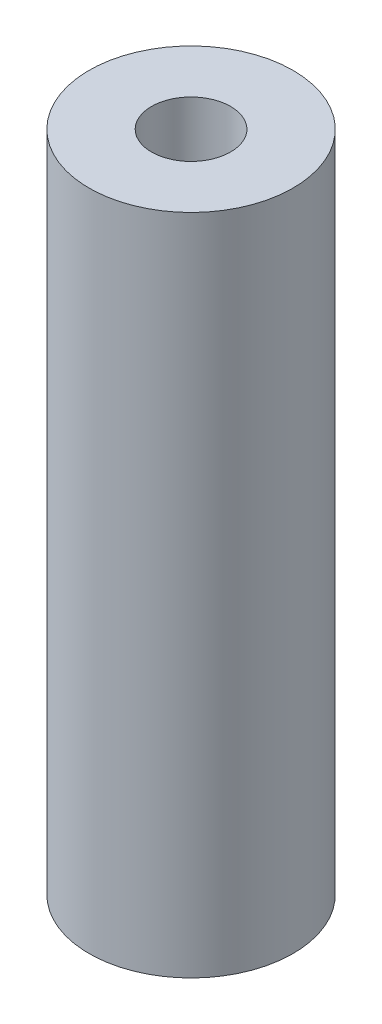
ISO-10303-21;
HEADER;
FILE_DESCRIPTION(('STEP AP214'),'2;1');
FILE_NAME('part.step','',(''),(''),'','','');
FILE_SCHEMA(('AUTOMOTIVE_DESIGN { 1 0 10303 214 1 1 1 1 }'));
ENDSEC;
DATA;
#1=APPLICATION_CONTEXT('core data for automotive mechanical design processes');
#2=APPLICATION_PROTOCOL_DEFINITION('international standard','automotive_design',2000,#1);
#3=PRODUCT_CONTEXT('',#1,'mechanical');
#4=PRODUCT('Part','Part','',(#3));
#5=PRODUCT_RELATED_PRODUCT_CATEGORY('part','',(#4));
#6=PRODUCT_DEFINITION_FORMATION('','',#4);
#7=PRODUCT_DEFINITION_CONTEXT('part definition',#1,'design');
#8=PRODUCT_DEFINITION('design','',#6,#7);
#9=PRODUCT_DEFINITION_SHAPE('','',#8);
#10=(LENGTH_UNIT() NAMED_UNIT(*) SI_UNIT(.MILLI.,.METRE.));
#11=(NAMED_UNIT(*) PLANE_ANGLE_UNIT() SI_UNIT($,.RADIAN.));
#12=(NAMED_UNIT(*) SI_UNIT($,.STERADIAN.) SOLID_ANGLE_UNIT());
#13=UNCERTAINTY_MEASURE_WITH_UNIT(LENGTH_MEASURE(1.E-05),#10,'distance_accuracy_value','');
#14=(GEOMETRIC_REPRESENTATION_CONTEXT(3) GLOBAL_UNCERTAINTY_ASSIGNED_CONTEXT((#13)) GLOBAL_UNIT_ASSIGNED_CONTEXT((#10,
#11,#12)) REPRESENTATION_CONTEXT('',''));
#15=CARTESIAN_POINT('',(0.,0.,0.));
#16=DIRECTION('',(0.,0.,1.));
#17=DIRECTION('',(1.,0.,0.));
#18=AXIS2_PLACEMENT_3D('',#15,#16,#17);
#19=CARTESIAN_POINT('',(0.,26.,0.));
#20=DIRECTION('',(0.,1.,0.));
#21=DIRECTION('',(0.,0.,1.));
#22=AXIS2_PLACEMENT_3D('',#19,#20,#21);
#23=PLANE('',#22);
#24=CARTESIAN_POINT('',(0.,26.,0.));
#25=DIRECTION('',(0.,1.,0.));
#26=DIRECTION('',(0.,0.,1.));
#27=AXIS2_PLACEMENT_3D('',#24,#25,#26);
#28=CIRCLE('',#27,4.);
#29=CARTESIAN_POINT('',(0.,26.,-4.));
#30=VERTEX_POINT('',#29);
#31=EDGE_CURVE('E10',#30,#30,#28,.T.);
#32=ORIENTED_EDGE('',*,*,#31,.T.);
#33=EDGE_LOOP('',(#32));
#34=FACE_BOUND('',#33,.T.);
#35=CARTESIAN_POINT('',(0.,26.,0.));
#36=DIRECTION('',(0.,1.,0.));
#37=DIRECTION('',(0.,0.,1.));
#38=AXIS2_PLACEMENT_3D('',#35,#36,#37);
#39=CIRCLE('',#38,1.55);
#40=CARTESIAN_POINT('',(0.,26.,-1.55));
#41=VERTEX_POINT('',#40);
#42=EDGE_CURVE('E42',#41,#41,#39,.T.);
#43=ORIENTED_EDGE('',*,*,#42,.F.);
#44=EDGE_LOOP('',(#43));
#45=FACE_BOUND('',#44,.T.);
#46=ADVANCED_FACE('F31',(#34,#45),#23,.T.);
#47=CARTESIAN_POINT('',(0.,0.,0.));
#48=DIRECTION('',(0.,1.,0.));
#49=DIRECTION('',(0.,0.,1.));
#50=AXIS2_PLACEMENT_3D('',#47,#48,#49);
#51=PLANE('',#50);
#52=CARTESIAN_POINT('',(0.,0.,0.));
#53=DIRECTION('',(0.,1.,0.));
#54=DIRECTION('',(0.,0.,1.));
#55=AXIS2_PLACEMENT_3D('',#52,#53,#54);
#56=CIRCLE('',#55,4.);
#57=CARTESIAN_POINT('',(0.,0.,-4.));
#58=VERTEX_POINT('',#57);
#59=EDGE_CURVE('E35',#58,#58,#56,.T.);
#60=ORIENTED_EDGE('',*,*,#59,.F.);
#61=EDGE_LOOP('',(#60));
#62=FACE_BOUND('',#61,.T.);
#63=CARTESIAN_POINT('',(0.,0.,0.));
#64=DIRECTION('',(0.,1.,0.));
#65=DIRECTION('',(0.,0.,1.));
#66=AXIS2_PLACEMENT_3D('',#63,#64,#65);
#67=CIRCLE('',#66,1.55);
#68=CARTESIAN_POINT('',(0.,0.,-1.55));
#69=VERTEX_POINT('',#68);
#70=EDGE_CURVE('E44',#69,#69,#67,.T.);
#71=ORIENTED_EDGE('',*,*,#70,.T.);
#72=EDGE_LOOP('',(#71));
#73=FACE_BOUND('',#72,.T.);
#74=ADVANCED_FACE('F54',(#62,#73),#51,.F.);
#75=CARTESIAN_POINT('',(0.,26.,0.));
#76=DIRECTION('',(0.,-1.,0.));
#77=DIRECTION('',(0.,0.,-1.));
#78=AXIS2_PLACEMENT_3D('',#75,#76,#77);
#79=CYLINDRICAL_SURFACE('',#78,4.);
#80=CARTESIAN_POINT('',(0.,26.,-4.));
#81=CARTESIAN_POINT('',(0.,25.7291666666667,-4.));
#82=CARTESIAN_POINT('',(0.,25.4583333333333,-4.));
#83=CARTESIAN_POINT('',(0.,24.9166666666667,-4.));
#84=CARTESIAN_POINT('',(0.,24.6458333333333,-4.));
#85=CARTESIAN_POINT('',(0.,24.1041666666667,-4.));
#86=CARTESIAN_POINT('',(0.,23.8333333333333,-4.));
#87=CARTESIAN_POINT('',(0.,23.2916666666667,-4.));
#88=CARTESIAN_POINT('',(0.,23.0208333333333,-4.));
#89=CARTESIAN_POINT('',(0.,22.4791666666667,-4.));
#90=CARTESIAN_POINT('',(0.,22.2083333333333,-4.));
#91=CARTESIAN_POINT('',(0.,21.6666666666667,-4.));
#92=CARTESIAN_POINT('',(0.,21.3958333333333,-4.));
#93=CARTESIAN_POINT('',(0.,20.8541666666667,-4.));
#94=CARTESIAN_POINT('',(0.,20.5833333333333,-4.));
#95=CARTESIAN_POINT('',(0.,20.0416666666667,-4.));
#96=CARTESIAN_POINT('',(0.,19.7708333333333,-4.));
#97=CARTESIAN_POINT('',(0.,19.2291666666667,-4.));
#98=CARTESIAN_POINT('',(0.,18.9583333333333,-4.));
#99=CARTESIAN_POINT('',(0.,18.4166666666667,-4.));
#100=CARTESIAN_POINT('',(0.,18.1458333333333,-4.));
#101=CARTESIAN_POINT('',(0.,17.6041666666667,-4.));
#102=CARTESIAN_POINT('',(0.,17.3333333333333,-4.));
#103=CARTESIAN_POINT('',(0.,16.7916666666667,-4.));
#104=CARTESIAN_POINT('',(0.,16.5208333333333,-4.));
#105=CARTESIAN_POINT('',(0.,15.9791666666667,-4.));
#106=CARTESIAN_POINT('',(0.,15.7083333333333,-4.));
#107=CARTESIAN_POINT('',(0.,15.1666666666667,-4.));
#108=CARTESIAN_POINT('',(0.,14.8958333333333,-4.));
#109=CARTESIAN_POINT('',(0.,14.3541666666667,-4.));
#110=CARTESIAN_POINT('',(0.,14.0833333333333,-4.));
#111=CARTESIAN_POINT('',(0.,13.5416666666667,-4.));
#112=CARTESIAN_POINT('',(0.,13.2708333333333,-4.));
#113=CARTESIAN_POINT('',(0.,12.7291666666667,-4.));
#114=CARTESIAN_POINT('',(0.,12.4583333333333,-4.));
#115=CARTESIAN_POINT('',(0.,11.9166666666667,-4.));
#116=CARTESIAN_POINT('',(0.,11.6458333333333,-4.));
#117=CARTESIAN_POINT('',(0.,11.1041666666667,-4.));
#118=CARTESIAN_POINT('',(0.,10.8333333333333,-4.));
#119=CARTESIAN_POINT('',(0.,10.2916666666667,-4.));
#120=CARTESIAN_POINT('',(0.,10.0208333333333,-4.));
#121=CARTESIAN_POINT('',(0.,9.47916666666667,-4.));
#122=CARTESIAN_POINT('',(0.,9.20833333333333,-4.));
#123=CARTESIAN_POINT('',(0.,8.66666666666667,-4.));
#124=CARTESIAN_POINT('',(0.,8.39583333333333,-4.));
#125=CARTESIAN_POINT('',(0.,7.85416666666667,-4.));
#126=CARTESIAN_POINT('',(0.,7.58333333333333,-4.));
#127=CARTESIAN_POINT('',(0.,7.04166666666667,-4.));
#128=CARTESIAN_POINT('',(0.,6.77083333333333,-4.));
#129=CARTESIAN_POINT('',(0.,6.22916666666667,-4.));
#130=CARTESIAN_POINT('',(0.,5.95833333333333,-4.));
#131=CARTESIAN_POINT('',(0.,5.41666666666667,-4.));
#132=CARTESIAN_POINT('',(0.,5.14583333333333,-4.));
#133=CARTESIAN_POINT('',(0.,4.60416666666667,-4.));
#134=CARTESIAN_POINT('',(0.,4.33333333333333,-4.));
#135=CARTESIAN_POINT('',(0.,3.79166666666667,-4.));
#136=CARTESIAN_POINT('',(0.,3.52083333333333,-4.));
#137=CARTESIAN_POINT('',(0.,2.97916666666667,-4.));
#138=CARTESIAN_POINT('',(0.,2.70833333333333,-4.));
#139=CARTESIAN_POINT('',(0.,2.16666666666667,-4.));
#140=CARTESIAN_POINT('',(0.,1.89583333333333,-4.));
#141=CARTESIAN_POINT('',(0.,1.35416666666667,-4.));
#142=CARTESIAN_POINT('',(0.,1.08333333333333,-4.));
#143=CARTESIAN_POINT('',(0.,0.541666666666667,-4.));
#144=CARTESIAN_POINT('',(0.,0.270833333333334,-4.));
#145=CARTESIAN_POINT('',(0.,0.,-4.));
#146=B_SPLINE_CURVE_WITH_KNOTS('',3,(#80,#81,#82,#83,#84,#85,#86,#87,#88,#89,#90,#91,#92,#93,
#94,#95,#96,#97,#98,#99,#100,#101,#102,#103,#104,#105,#106,#107,#108,#109,#110,#111,#112,#113,
#114,#115,#116,#117,#118,#119,#120,#121,#122,#123,#124,#125,#126,#127,#128,#129,#130,#131,#132,
#133,#134,#135,#136,#137,#138,#139,#140,#141,#142,#143,#144,#145),.UNSPECIFIED.,.F.,.F.,(4,2,2,
2,2,2,2,2,2,2,2,2,2,2,2,2,2,2,2,2,2,2,2,2,2,2,2,2,2,2,2,2,4),(0.,0.812500000000001,1.625,2.4375,
3.25,4.0625,4.875,5.6875,6.5,7.3125,8.125,8.9375,9.75,10.5625,11.375,12.1875,13.,13.8125,14.625,
15.4375,16.25,17.0625,17.875,18.6875,19.5,20.3125,21.125,21.9375,22.75,23.5625,24.375,25.1875,
26.),.UNSPECIFIED.);
#147=EDGE_CURVE('BSEAM33',#30,#58,#146,.T.);
#148=ORIENTED_EDGE('',*,*,#31,.F.);
#149=ORIENTED_EDGE('',*,*,#59,.T.);
#150=ORIENTED_EDGE('',*,*,#147,.T.);
#151=ORIENTED_EDGE('',*,*,#147,.F.);
#152=EDGE_LOOP('',(#148,#150,#149,#151));
#153=FACE_BOUND('',#152,.T.);
#154=ADVANCED_FACE('F33',(#153),#79,.T.);
#155=CARTESIAN_POINT('',(0.,26.,0.));
#156=DIRECTION('',(0.,-1.,0.));
#157=DIRECTION('',(0.,0.,-1.));
#158=AXIS2_PLACEMENT_3D('',#155,#156,#157);
#159=CYLINDRICAL_SURFACE('',#158,1.55);
#160=CARTESIAN_POINT('',(0.,26.,-1.55));
#161=CARTESIAN_POINT('',(0.,25.7291666666667,-1.55));
#162=CARTESIAN_POINT('',(0.,25.4583333333333,-1.55));
#163=CARTESIAN_POINT('',(0.,24.9166666666667,-1.55));
#164=CARTESIAN_POINT('',(0.,24.6458333333333,-1.55));
#165=CARTESIAN_POINT('',(0.,24.1041666666667,-1.55));
#166=CARTESIAN_POINT('',(0.,23.8333333333333,-1.55));
#167=CARTESIAN_POINT('',(0.,23.2916666666667,-1.55));
#168=CARTESIAN_POINT('',(0.,23.0208333333333,-1.55));
#169=CARTESIAN_POINT('',(0.,22.4791666666667,-1.55));
#170=CARTESIAN_POINT('',(0.,22.2083333333333,-1.55));
#171=CARTESIAN_POINT('',(0.,21.6666666666667,-1.55));
#172=CARTESIAN_POINT('',(0.,21.3958333333333,-1.55));
#173=CARTESIAN_POINT('',(0.,20.8541666666667,-1.55));
#174=CARTESIAN_POINT('',(0.,20.5833333333333,-1.55));
#175=CARTESIAN_POINT('',(0.,20.0416666666667,-1.55));
#176=CARTESIAN_POINT('',(0.,19.7708333333333,-1.55));
#177=CARTESIAN_POINT('',(0.,19.2291666666667,-1.55));
#178=CARTESIAN_POINT('',(0.,18.9583333333333,-1.55));
#179=CARTESIAN_POINT('',(0.,18.4166666666667,-1.55));
#180=CARTESIAN_POINT('',(0.,18.1458333333333,-1.55));
#181=CARTESIAN_POINT('',(0.,17.6041666666667,-1.55));
#182=CARTESIAN_POINT('',(0.,17.3333333333333,-1.55));
#183=CARTESIAN_POINT('',(0.,16.7916666666667,-1.55));
#184=CARTESIAN_POINT('',(0.,16.5208333333333,-1.55));
#185=CARTESIAN_POINT('',(0.,15.9791666666667,-1.55));
#186=CARTESIAN_POINT('',(0.,15.7083333333333,-1.55));
#187=CARTESIAN_POINT('',(0.,15.1666666666667,-1.55));
#188=CARTESIAN_POINT('',(0.,14.8958333333333,-1.55));
#189=CARTESIAN_POINT('',(0.,14.3541666666667,-1.55));
#190=CARTESIAN_POINT('',(0.,14.0833333333333,-1.55));
#191=CARTESIAN_POINT('',(0.,13.5416666666667,-1.55));
#192=CARTESIAN_POINT('',(0.,13.2708333333333,-1.55));
#193=CARTESIAN_POINT('',(0.,12.7291666666667,-1.55));
#194=CARTESIAN_POINT('',(0.,12.4583333333333,-1.55));
#195=CARTESIAN_POINT('',(0.,11.9166666666667,-1.55));
#196=CARTESIAN_POINT('',(0.,11.6458333333333,-1.55));
#197=CARTESIAN_POINT('',(0.,11.1041666666667,-1.55));
#198=CARTESIAN_POINT('',(0.,10.8333333333333,-1.55));
#199=CARTESIAN_POINT('',(0.,10.2916666666667,-1.55));
#200=CARTESIAN_POINT('',(0.,10.0208333333333,-1.55));
#201=CARTESIAN_POINT('',(0.,9.47916666666667,-1.55));
#202=CARTESIAN_POINT('',(0.,9.20833333333333,-1.55));
#203=CARTESIAN_POINT('',(0.,8.66666666666667,-1.55));
#204=CARTESIAN_POINT('',(0.,8.39583333333333,-1.55));
#205=CARTESIAN_POINT('',(0.,7.85416666666667,-1.55));
#206=CARTESIAN_POINT('',(0.,7.58333333333333,-1.55));
#207=CARTESIAN_POINT('',(0.,7.04166666666667,-1.55));
#208=CARTESIAN_POINT('',(0.,6.77083333333333,-1.55));
#209=CARTESIAN_POINT('',(0.,6.22916666666667,-1.55));
#210=CARTESIAN_POINT('',(0.,5.95833333333333,-1.55));
#211=CARTESIAN_POINT('',(0.,5.41666666666667,-1.55));
#212=CARTESIAN_POINT('',(0.,5.14583333333333,-1.55));
#213=CARTESIAN_POINT('',(0.,4.60416666666667,-1.55));
#214=CARTESIAN_POINT('',(0.,4.33333333333333,-1.55));
#215=CARTESIAN_POINT('',(0.,3.79166666666667,-1.55));
#216=CARTESIAN_POINT('',(0.,3.52083333333333,-1.55));
#217=CARTESIAN_POINT('',(0.,2.97916666666667,-1.55));
#218=CARTESIAN_POINT('',(0.,2.70833333333333,-1.55));
#219=CARTESIAN_POINT('',(0.,2.16666666666667,-1.55));
#220=CARTESIAN_POINT('',(0.,1.89583333333333,-1.55));
#221=CARTESIAN_POINT('',(0.,1.35416666666667,-1.55));
#222=CARTESIAN_POINT('',(0.,1.08333333333333,-1.55));
#223=CARTESIAN_POINT('',(0.,0.541666666666667,-1.55));
#224=CARTESIAN_POINT('',(0.,0.270833333333334,-1.55));
#225=CARTESIAN_POINT('',(0.,0.,-1.55));
#226=B_SPLINE_CURVE_WITH_KNOTS('',3,(#160,#161,#162,#163,#164,#165,#166,#167,#168,#169,#170,
#171,#172,#173,#174,#175,#176,#177,#178,#179,#180,#181,#182,#183,#184,#185,#186,#187,#188,#189,
#190,#191,#192,#193,#194,#195,#196,#197,#198,#199,#200,#201,#202,#203,#204,#205,#206,#207,#208,
#209,#210,#211,#212,#213,#214,#215,#216,#217,#218,#219,#220,#221,#222,#223,#224,#225),
.UNSPECIFIED.,.F.,.F.,(4,2,2,2,2,2,2,2,2,2,2,2,2,2,2,2,2,2,2,2,2,2,2,2,2,2,2,2,2,2,2,2,4),(0.,
0.812499999999997,1.625,2.4375,3.25,4.0625,4.875,5.6875,6.5,7.3125,8.125,8.93749999999999,
9.74999999999999,10.5625,11.375,12.1875,13.,13.8125,14.625,15.4375,16.25,17.0625,17.875,18.6875,
19.5,20.3125,21.125,21.9375,22.75,23.5625,24.375,25.1875,26.),.UNSPECIFIED.);
#227=EDGE_CURVE('BSEAM50',#41,#69,#226,.T.);
#228=ORIENTED_EDGE('',*,*,#42,.T.);
#229=ORIENTED_EDGE('',*,*,#70,.F.);
#230=ORIENTED_EDGE('',*,*,#227,.T.);
#231=ORIENTED_EDGE('',*,*,#227,.F.);
#232=EDGE_LOOP('',(#228,#230,#229,#231));
#233=FACE_BOUND('',#232,.T.);
#234=ADVANCED_FACE('F50',(#233),#159,.F.);
#235=CLOSED_SHELL('',(#46,#74,#154,#234));
#236=MANIFOLD_SOLID_BREP('B2',#235);
#237=ADVANCED_BREP_SHAPE_REPRESENTATION('',(#18,#236),#14);
#238=SHAPE_DEFINITION_REPRESENTATION(#9,#237);
ENDSEC;
END-ISO-10303-21;
